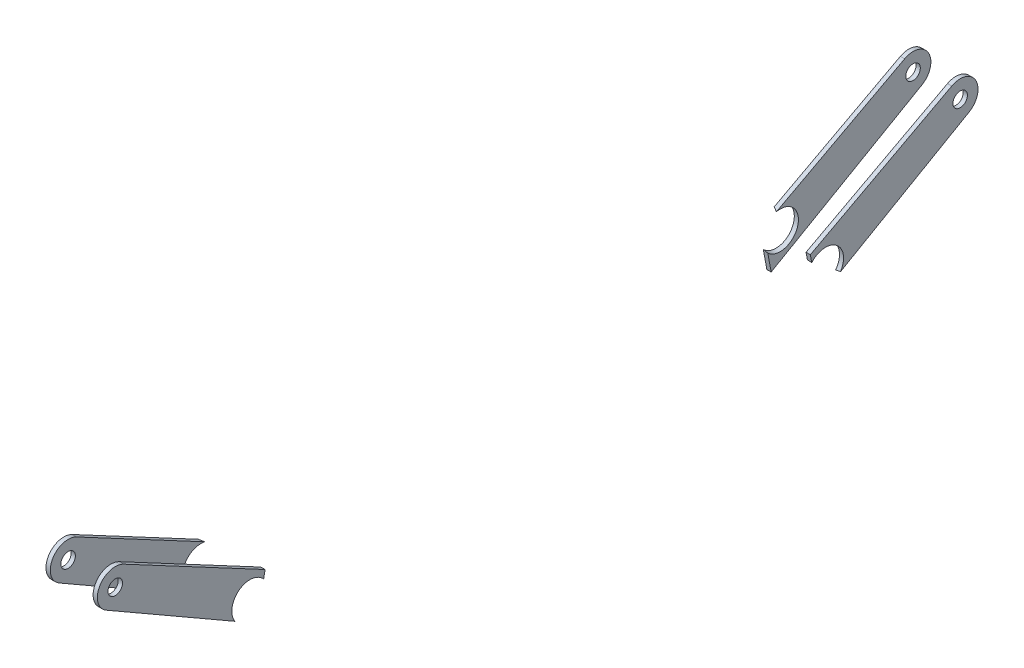
ISO-10303-21;
HEADER;
FILE_DESCRIPTION(('STEP AP214'),'2;1');
FILE_NAME('part.step','',(''),(''),'','','');
FILE_SCHEMA(('AUTOMOTIVE_DESIGN { 1 0 10303 214 1 1 1 1 }'));
ENDSEC;
DATA;
#1=APPLICATION_CONTEXT('core data for automotive mechanical design processes');
#2=APPLICATION_PROTOCOL_DEFINITION('international standard','automotive_design',2000,#1);
#3=PRODUCT_CONTEXT('',#1,'mechanical');
#4=PRODUCT('Part','Part','',(#3));
#5=PRODUCT_RELATED_PRODUCT_CATEGORY('part','',(#4));
#6=PRODUCT_DEFINITION_FORMATION('','',#4);
#7=PRODUCT_DEFINITION_CONTEXT('part definition',#1,'design');
#8=PRODUCT_DEFINITION('design','',#6,#7);
#9=PRODUCT_DEFINITION_SHAPE('','',#8);
#10=(LENGTH_UNIT() NAMED_UNIT(*) SI_UNIT(.MILLI.,.METRE.));
#11=(NAMED_UNIT(*) PLANE_ANGLE_UNIT() SI_UNIT($,.RADIAN.));
#12=(NAMED_UNIT(*) SI_UNIT($,.STERADIAN.) SOLID_ANGLE_UNIT());
#13=UNCERTAINTY_MEASURE_WITH_UNIT(LENGTH_MEASURE(1.E-05),#10,'distance_accuracy_value','');
#14=(GEOMETRIC_REPRESENTATION_CONTEXT(3) GLOBAL_UNCERTAINTY_ASSIGNED_CONTEXT((#13)) GLOBAL_UNIT_ASSIGNED_CONTEXT((#10,
#11,#12)) REPRESENTATION_CONTEXT('',''));
#15=CARTESIAN_POINT('',(0.,0.,0.));
#16=DIRECTION('',(0.,0.,1.));
#17=DIRECTION('',(1.,0.,0.));
#18=AXIS2_PLACEMENT_3D('',#15,#16,#17);
#19=CARTESIAN_POINT('',(942.,45.5636748828678,243.393475636366));
#20=DIRECTION('',(0.,-0.184005288410075,-0.982925253433406));
#21=DIRECTION('',(0.,-0.982925253433406,0.184005288410075));
#22=AXIS2_PLACEMENT_3D('',#19,#20,#21);
#23=PLANE('',#22);
#24=DIRECTION('',(0.,-0.982925253433406,0.184005288410075));
#25=VECTOR('',#24,1.);
#26=CARTESIAN_POINT('',(945.,45.5636748828678,243.393475636366));
#27=LINE('',#26,#25);
#28=CARTESIAN_POINT('',(945.,308.994873823411,194.078704683083));
#29=VERTEX_POINT('',#28);
#30=CARTESIAN_POINT('',(945.,296.336042583873,196.448459539853));
#31=VERTEX_POINT('',#30);
#32=EDGE_CURVE('E103',#29,#31,#27,.T.);
#33=ORIENTED_EDGE('',*,*,#32,.T.);
#34=DIRECTION('',(1.,0.,0.));
#35=VECTOR('',#34,1.);
#36=CARTESIAN_POINT('',(942.,296.336042583873,196.448459539853));
#37=LINE('',#36,#35);
#38=CARTESIAN_POINT('',(942.,296.336042583873,196.448459539853));
#39=VERTEX_POINT('',#38);
#40=EDGE_CURVE('E124',#39,#31,#37,.T.);
#41=ORIENTED_EDGE('',*,*,#40,.F.);
#42=DIRECTION('',(0.,-0.982925253433406,0.184005288410075));
#43=VECTOR('',#42,1.);
#44=CARTESIAN_POINT('',(942.,45.5636748828678,243.393475636366));
#45=LINE('',#44,#43);
#46=CARTESIAN_POINT('',(942.,309.822620696571,193.923749052841));
#47=VERTEX_POINT('',#46);
#48=EDGE_CURVE('E122',#47,#39,#45,.T.);
#49=ORIENTED_EDGE('',*,*,#48,.F.);
#50=CARTESIAN_POINT('',(1082.48907602166,293.161292829988,197.042778123135));
#51=DIRECTION('',(0.,0.184005288410075,0.982925253433406));
#52=DIRECTION('',(0.985358258221693,-0.167585449342957,0.0313722827162788));
#53=AXIS2_PLACEMENT_3D('',#50,#51,#52);
#54=ELLIPSE('',#53,172.129049879404,12.7);
#55=EDGE_CURVE('E125',#29,#47,#54,.F.);
#56=ORIENTED_EDGE('',*,*,#55,.F.);
#57=EDGE_LOOP('',(#33,#41,#49,#56));
#58=FACE_BOUND('',#57,.T.);
#59=ADVANCED_FACE('F50',(#58),#23,.T.);
#60=CARTESIAN_POINT('',(942.,367.858419329999,295.772586620002));
#61=DIRECTION('',(1.,0.,0.));
#62=DIRECTION('',(0.,0.,1.));
#63=AXIS2_PLACEMENT_3D('',#60,#61,#62);
#64=CYLINDRICAL_SURFACE('',#63,12.5);
#65=CARTESIAN_POINT('',(945.,367.858419329999,295.772586620002));
#66=DIRECTION('',(1.,0.,0.));
#67=DIRECTION('',(0.,0.,-1.));
#68=AXIS2_PLACEMENT_3D('',#65,#66,#67);
#69=CIRCLE('',#68,12.5);
#70=CARTESIAN_POINT('',(945.,378.890499641518,289.895239939721));
#71=VERTEX_POINT('',#70);
#72=CARTESIAN_POINT('',(945.,357.021731817941,302.00285176412));
#73=VERTEX_POINT('',#72);
#74=EDGE_CURVE('E134',#71,#73,#69,.T.);
#75=ORIENTED_EDGE('',*,*,#74,.F.);
#76=DIRECTION('',(1.,0.,0.));
#77=VECTOR('',#76,1.);
#78=CARTESIAN_POINT('',(942.,378.890499641518,289.895239939721));
#79=LINE('',#78,#77);
#80=CARTESIAN_POINT('',(942.,378.890499641518,289.895239939721));
#81=VERTEX_POINT('',#80);
#82=EDGE_CURVE('E111',#81,#71,#79,.T.);
#83=ORIENTED_EDGE('',*,*,#82,.F.);
#84=CARTESIAN_POINT('',(942.,367.858419329999,295.772586620002));
#85=DIRECTION('',(1.,0.,0.));
#86=DIRECTION('',(0.,0.,-1.));
#87=AXIS2_PLACEMENT_3D('',#84,#85,#86);
#88=CIRCLE('',#87,12.5);
#89=CARTESIAN_POINT('',(942.,357.021731817941,302.00285176412));
#90=VERTEX_POINT('',#89);
#91=EDGE_CURVE('E118',#81,#90,#88,.T.);
#92=ORIENTED_EDGE('',*,*,#91,.T.);
#93=DIRECTION('',(1.,0.,0.));
#94=VECTOR('',#93,1.);
#95=CARTESIAN_POINT('',(942.,357.021731817941,302.00285176412));
#96=LINE('',#95,#94);
#97=EDGE_CURVE('E129',#90,#73,#96,.T.);
#98=ORIENTED_EDGE('',*,*,#97,.T.);
#99=EDGE_LOOP('',(#75,#83,#92,#98));
#100=FACE_BOUND('',#99,.T.);
#101=ADVANCED_FACE('F142',(#100),#64,.T.);
#102=CARTESIAN_POINT('',(942.,137.834002874389,-79.2439924863662));
#103=DIRECTION('',(0.,-0.86693500096461,0.498421211529456));
#104=DIRECTION('',(0.,0.498421211529456,0.86693500096461));
#105=AXIS2_PLACEMENT_3D('',#102,#103,#104);
#106=PLANE('',#105);
#107=DIRECTION('',(0.,0.498421211529456,0.86693500096461));
#108=VECTOR('',#107,1.);
#109=CARTESIAN_POINT('',(945.,137.834002874389,-79.2439924863662));
#110=LINE('',#109,#108);
#111=EDGE_CURVE('E113',#31,#73,#110,.T.);
#112=ORIENTED_EDGE('',*,*,#111,.T.);
#113=ORIENTED_EDGE('',*,*,#97,.F.);
#114=DIRECTION('',(0.,0.498421211529456,0.86693500096461));
#115=VECTOR('',#114,1.);
#116=CARTESIAN_POINT('',(942.,137.834002874389,-79.2439924863662));
#117=LINE('',#116,#115);
#118=EDGE_CURVE('E132',#39,#90,#117,.T.);
#119=ORIENTED_EDGE('',*,*,#118,.F.);
#120=ORIENTED_EDGE('',*,*,#40,.T.);
#121=EDGE_LOOP('',(#112,#113,#119,#120));
#122=FACE_BOUND('',#121,.T.);
#123=ADVANCED_FACE('F146',(#122),#106,.T.);
#124=CARTESIAN_POINT('',(942.,367.858419329999,295.772586620002));
#125=DIRECTION('',(1.,0.,0.));
#126=DIRECTION('',(0.,0.,1.));
#127=AXIS2_PLACEMENT_3D('',#124,#125,#126);
#128=CYLINDRICAL_SURFACE('',#127,5.09999999999999);
#129=CARTESIAN_POINT('',(942.,367.858419329999,295.772586620002));
#130=DIRECTION('',(1.,0.,0.));
#131=DIRECTION('',(0.,0.,-1.));
#132=AXIS2_PLACEMENT_3D('',#129,#130,#131);
#133=CIRCLE('',#132,5.09999999999999);
#134=CARTESIAN_POINT('',(942.,367.858419329999,290.672586620002));
#135=VERTEX_POINT('',#134);
#136=EDGE_CURVE('E121',#135,#135,#133,.T.);
#137=ORIENTED_EDGE('',*,*,#136,.F.);
#138=EDGE_LOOP('',(#137));
#139=FACE_BOUND('',#138,.T.);
#140=CARTESIAN_POINT('',(945.,367.858419329999,295.772586620002));
#141=DIRECTION('',(1.,0.,0.));
#142=DIRECTION('',(0.,0.,-1.));
#143=AXIS2_PLACEMENT_3D('',#140,#141,#142);
#144=CIRCLE('',#143,5.09999999999999);
#145=CARTESIAN_POINT('',(945.,367.858419329999,290.672586620002));
#146=VERTEX_POINT('',#145);
#147=EDGE_CURVE('E60',#146,#146,#144,.T.);
#148=ORIENTED_EDGE('',*,*,#147,.T.);
#149=EDGE_LOOP('',(#148));
#150=FACE_BOUND('',#149,.T.);
#151=ADVANCED_FACE('F158',(#139,#150),#128,.F.);
#152=CARTESIAN_POINT('',(942.,174.828331192109,-93.1398868514354));
#153=DIRECTION('',(0.,0.882566424921512,-0.470187734422392));
#154=DIRECTION('',(0.,-0.470187734422392,-0.882566424921512));
#155=AXIS2_PLACEMENT_3D('',#152,#153,#154);
#156=PLANE('',#155);
#157=DIRECTION('',(0.,-0.470187734422392,-0.882566424921512));
#158=VECTOR('',#157,1.);
#159=CARTESIAN_POINT('',(942.,174.828331192109,-93.1398868514354));
#160=LINE('',#159,#158);
#161=CARTESIAN_POINT('',(942.,331.81956219008,201.540682934411));
#162=VERTEX_POINT('',#161);
#163=EDGE_CURVE('E107',#81,#162,#160,.T.);
#164=ORIENTED_EDGE('',*,*,#163,.F.);
#165=ORIENTED_EDGE('',*,*,#82,.T.);
#166=DIRECTION('',(0.,-0.470187734422392,-0.882566424921512));
#167=VECTOR('',#166,1.);
#168=CARTESIAN_POINT('',(945.,174.828331192109,-93.1398868514354));
#169=LINE('',#168,#167);
#170=CARTESIAN_POINT('',(945.,331.028402659965,200.055636033103));
#171=VERTEX_POINT('',#170);
#172=EDGE_CURVE('E100',#71,#171,#169,.T.);
#173=ORIENTED_EDGE('',*,*,#172,.T.);
#174=CARTESIAN_POINT('',(858.006304522725,334.441720058987,206.462607362711));
#175=DIRECTION('',(0.,-0.882566424921512,0.470187734422392));
#176=DIRECTION('',(0.992460257714831,-0.0576294374532364,-0.108173401515509));
#177=AXIS2_PLACEMENT_3D('',#174,#175,#176);
#178=ELLIPSE('',#177,90.6522629238937,12.7);
#179=EDGE_CURVE('E105',#162,#171,#178,.F.);
#180=ORIENTED_EDGE('',*,*,#179,.F.);
#181=EDGE_LOOP('',(#164,#165,#173,#180));
#182=FACE_BOUND('',#181,.T.);
#183=ADVANCED_FACE('F109',(#182),#156,.T.);
#184=CARTESIAN_POINT('',(942.,0.,0.));
#185=DIRECTION('',(-1.,0.,0.));
#186=DIRECTION('',(0.,0.,-1.));
#187=AXIS2_PLACEMENT_3D('',#184,#185,#186);
#188=PLANE('',#187);
#189=ORIENTED_EDGE('',*,*,#136,.T.);
#190=EDGE_LOOP('',(#189));
#191=FACE_BOUND('',#190,.T.);
#192=ORIENTED_EDGE('',*,*,#48,.T.);
#193=ORIENTED_EDGE('',*,*,#118,.T.);
#194=ORIENTED_EDGE('',*,*,#91,.F.);
#195=ORIENTED_EDGE('',*,*,#163,.T.);
#196=CARTESIAN_POINT('',(942.,318.996010748236,202.938032789287));
#197=DIRECTION('',(1.,0.,0.));
#198=DIRECTION('',(0.,-0.974938972330076,-0.222472470728346));
#199=AXIS2_PLACEMENT_3D('',#196,#197,#198);
#200=ELLIPSE('',#199,12.9239386363324,12.7);
#201=EDGE_CURVE('E54',#47,#162,#200,.F.);
#202=ORIENTED_EDGE('',*,*,#201,.F.);
#203=EDGE_LOOP('',(#192,#193,#194,#195,#202));
#204=FACE_BOUND('',#203,.T.);
#205=ADVANCED_FACE('F149',(#191,#204),#188,.T.);
#206=CARTESIAN_POINT('',(945.,0.,0.));
#207=DIRECTION('',(-1.,0.,0.));
#208=DIRECTION('',(0.,0.,-1.));
#209=AXIS2_PLACEMENT_3D('',#206,#207,#208);
#210=PLANE('',#209);
#211=CARTESIAN_POINT('',(945.,318.444336867608,202.812145677639));
#212=DIRECTION('',(1.,0.,0.));
#213=DIRECTION('',(0.,-0.974938972330076,-0.222472470728346));
#214=AXIS2_PLACEMENT_3D('',#211,#212,#213);
#215=ELLIPSE('',#214,12.9239386363324,12.7);
#216=EDGE_CURVE('E12',#29,#171,#215,.F.);
#217=ORIENTED_EDGE('',*,*,#216,.T.);
#218=ORIENTED_EDGE('',*,*,#172,.F.);
#219=ORIENTED_EDGE('',*,*,#74,.T.);
#220=ORIENTED_EDGE('',*,*,#111,.F.);
#221=ORIENTED_EDGE('',*,*,#32,.F.);
#222=EDGE_LOOP('',(#217,#218,#219,#220,#221));
#223=FACE_BOUND('',#222,.T.);
#224=ORIENTED_EDGE('',*,*,#147,.F.);
#225=EDGE_LOOP('',(#224));
#226=FACE_BOUND('',#225,.T.);
#227=ADVANCED_FACE('F96',(#223,#226),#210,.F.);
#228=CARTESIAN_POINT('',(773.70714337,349.94360184793,209.999999999999));
#229=DIRECTION('',(0.982672570442046,-0.180704930107559,-0.0412352705295394));
#230=DIRECTION('',(0.180858756895923,0.983509079802552,0.));
#231=AXIS2_PLACEMENT_3D('',#228,#229,#230);
#232=CYLINDRICAL_SURFACE('',#231,12.7);
#233=ORIENTED_EDGE('',*,*,#55,.T.);
#234=ORIENTED_EDGE('',*,*,#201,.T.);
#235=ORIENTED_EDGE('',*,*,#179,.T.);
#236=ORIENTED_EDGE('',*,*,#216,.F.);
#237=EDGE_LOOP('',(#233,#234,#235,#236));
#238=FACE_BOUND('',#237,.T.);
#239=ADVANCED_FACE('F52',(#238),#232,.F.);
#240=CLOSED_SHELL('',(#59,#101,#123,#151,#183,#205,#227,#239));
#241=MANIFOLD_SOLID_BREP('B2',#240);
#242=CARTESIAN_POINT('',(978.000000000001,137.834002874389,-79.2439924863662));
#243=DIRECTION('',(0.,-0.86693500096461,0.498421211529456));
#244=DIRECTION('',(0.,0.498421211529456,0.86693500096461));
#245=AXIS2_PLACEMENT_3D('',#242,#243,#244);
#246=PLANE('',#245);
#247=DIRECTION('',(0.,0.498421211529456,0.86693500096461));
#248=VECTOR('',#247,1.);
#249=CARTESIAN_POINT('',(978.000000000001,137.834002874389,-79.2439924863662));
#250=LINE('',#249,#248);
#251=CARTESIAN_POINT('',(978.000000000001,305.269680891473,211.987292068771));
#252=VERTEX_POINT('',#251);
#253=CARTESIAN_POINT('',(978.000000000001,357.021731817941,302.00285176412));
#254=VERTEX_POINT('',#253);
#255=EDGE_CURVE('E243',#252,#254,#250,.T.);
#256=ORIENTED_EDGE('',*,*,#255,.T.);
#257=DIRECTION('',(-1.,0.,0.));
#258=VECTOR('',#257,1.);
#259=CARTESIAN_POINT('',(978.000000000001,357.021731817941,302.00285176412));
#260=LINE('',#259,#258);
#261=CARTESIAN_POINT('',(975.000000000001,357.021731817941,302.00285176412));
#262=VERTEX_POINT('',#261);
#263=EDGE_CURVE('E303',#254,#262,#260,.T.);
#264=ORIENTED_EDGE('',*,*,#263,.T.);
#265=DIRECTION('',(0.,0.498421211529456,0.86693500096461));
#266=VECTOR('',#265,1.);
#267=CARTESIAN_POINT('',(975.000000000001,137.834002874389,-79.2439924863662));
#268=LINE('',#267,#266);
#269=CARTESIAN_POINT('',(975.000000000001,305.009648322802,211.535001255383));
#270=VERTEX_POINT('',#269);
#271=EDGE_CURVE('E291',#270,#262,#268,.T.);
#272=ORIENTED_EDGE('',*,*,#271,.F.);
#273=CARTESIAN_POINT('',(1060.47917269027,297.208722424349,197.966365842482));
#274=DIRECTION('',(0.,0.86693500096461,-0.498421211529456));
#275=DIRECTION('',(0.991903064456792,-0.0632981412861595,-0.110098392499356));
#276=AXIS2_PLACEMENT_3D('',#273,#274,#275);
#277=ELLIPSE('',#276,93.3090125636205,12.7);
#278=EDGE_CURVE('E296',#252,#270,#277,.F.);
#279=ORIENTED_EDGE('',*,*,#278,.F.);
#280=EDGE_LOOP('',(#256,#264,#272,#279));
#281=FACE_BOUND('',#280,.T.);
#282=ADVANCED_FACE('F239',(#281),#246,.T.);
#283=CARTESIAN_POINT('',(978.000000000001,0.,0.));
#284=DIRECTION('',(1.,0.,0.));
#285=DIRECTION('',(0.,0.,-1.));
#286=AXIS2_PLACEMENT_3D('',#283,#284,#285);
#287=PLANE('',#286);
#288=CARTESIAN_POINT('',(978.000000000001,367.858419329999,295.772586620002));
#289=DIRECTION('',(1.,0.,0.));
#290=DIRECTION('',(0.,0.,-1.));
#291=AXIS2_PLACEMENT_3D('',#288,#289,#290);
#292=CIRCLE('',#291,5.09999999999999);
#293=CARTESIAN_POINT('',(978.000000000001,367.858419329999,290.672586620002));
#294=VERTEX_POINT('',#293);
#295=EDGE_CURVE('E304',#294,#294,#292,.T.);
#296=ORIENTED_EDGE('',*,*,#295,.F.);
#297=EDGE_LOOP('',(#296));
#298=FACE_BOUND('',#297,.T.);
#299=DIRECTION('',(0.,-0.982925253433406,0.184005288410075));
#300=VECTOR('',#299,1.);
#301=CARTESIAN_POINT('',(978.000000000001,45.5636748828678,243.393475636366));
#302=LINE('',#301,#300);
#303=CARTESIAN_POINT('',(978.000000000001,326.134794007556,190.870082312467));
#304=VERTEX_POINT('',#303);
#305=CARTESIAN_POINT('',(978.000000000001,320.811489069924,191.866614100538));
#306=VERTEX_POINT('',#305);
#307=EDGE_CURVE('E307',#304,#306,#302,.T.);
#308=ORIENTED_EDGE('',*,*,#307,.F.);
#309=DIRECTION('',(0.,-0.470187734422392,-0.882566424921512));
#310=VECTOR('',#309,1.);
#311=CARTESIAN_POINT('',(978.000000000001,174.828331192109,-93.1398868514354));
#312=LINE('',#311,#310);
#313=CARTESIAN_POINT('',(978.000000000001,378.890499641518,289.895239939721));
#314=VERTEX_POINT('',#313);
#315=EDGE_CURVE('E313',#314,#304,#312,.T.);
#316=ORIENTED_EDGE('',*,*,#315,.F.);
#317=CARTESIAN_POINT('',(978.000000000001,367.858419329999,295.772586620002));
#318=DIRECTION('',(1.,0.,0.));
#319=DIRECTION('',(0.,0.,-1.));
#320=AXIS2_PLACEMENT_3D('',#317,#318,#319);
#321=CIRCLE('',#320,12.5);
#322=EDGE_CURVE('E320',#314,#254,#321,.T.);
#323=ORIENTED_EDGE('',*,*,#322,.T.);
#324=ORIENTED_EDGE('',*,*,#255,.F.);
#325=CARTESIAN_POINT('',(978.000000000001,312.375924180697,201.427387449512));
#326=DIRECTION('',(-1.,0.,0.));
#327=DIRECTION('',(0.,-0.974938972330076,-0.222472470728346));
#328=AXIS2_PLACEMENT_3D('',#325,#326,#327);
#329=ELLIPSE('',#328,12.9239386363324,12.7);
#330=EDGE_CURVE('E297',#306,#252,#329,.F.);
#331=ORIENTED_EDGE('',*,*,#330,.F.);
#332=EDGE_LOOP('',(#308,#316,#323,#324,#331));
#333=FACE_BOUND('',#332,.T.);
#334=ADVANCED_FACE('F351',(#298,#333),#287,.T.);
#335=CARTESIAN_POINT('',(975.000000000001,0.,0.));
#336=DIRECTION('',(1.,0.,0.));
#337=DIRECTION('',(0.,0.,-1.));
#338=AXIS2_PLACEMENT_3D('',#335,#336,#337);
#339=PLANE('',#338);
#340=CARTESIAN_POINT('',(975.000000000001,312.927598061326,201.55327456116));
#341=DIRECTION('',(-1.,0.,0.));
#342=DIRECTION('',(0.,-0.974938972330076,-0.222472470728346));
#343=AXIS2_PLACEMENT_3D('',#340,#341,#342);
#344=ELLIPSE('',#343,12.9239386363324,12.7);
#345=CARTESIAN_POINT('',(975.000000000001,321.139528150929,191.805204623572));
#346=VERTEX_POINT('',#345);
#347=EDGE_CURVE('E48',#346,#270,#344,.F.);
#348=ORIENTED_EDGE('',*,*,#347,.T.);
#349=ORIENTED_EDGE('',*,*,#271,.T.);
#350=CARTESIAN_POINT('',(975.000000000001,367.858419329999,295.772586620002));
#351=DIRECTION('',(1.,0.,0.));
#352=DIRECTION('',(0.,0.,-1.));
#353=AXIS2_PLACEMENT_3D('',#350,#351,#352);
#354=CIRCLE('',#353,12.5);
#355=CARTESIAN_POINT('',(975.000000000001,378.890499641518,289.895239939721));
#356=VERTEX_POINT('',#355);
#357=EDGE_CURVE('E315',#356,#262,#354,.T.);
#358=ORIENTED_EDGE('',*,*,#357,.F.);
#359=DIRECTION('',(0.,-0.470187734422392,-0.882566424921512));
#360=VECTOR('',#359,1.);
#361=CARTESIAN_POINT('',(975.000000000001,174.828331192109,-93.1398868514354));
#362=LINE('',#361,#360);
#363=CARTESIAN_POINT('',(975.000000000001,326.134794007556,190.870082312467));
#364=VERTEX_POINT('',#363);
#365=EDGE_CURVE('E331',#356,#364,#362,.T.);
#366=ORIENTED_EDGE('',*,*,#365,.T.);
#367=DIRECTION('',(0.,-0.982925253433406,0.184005288410075));
#368=VECTOR('',#367,1.);
#369=CARTESIAN_POINT('',(975.000000000001,45.5636748828678,243.393475636366));
#370=LINE('',#369,#368);
#371=EDGE_CURVE('E294',#364,#346,#370,.T.);
#372=ORIENTED_EDGE('',*,*,#371,.T.);
#373=EDGE_LOOP('',(#348,#349,#358,#366,#372));
#374=FACE_BOUND('',#373,.T.);
#375=CARTESIAN_POINT('',(975.000000000001,367.858419329999,295.772586620002));
#376=DIRECTION('',(1.,0.,0.));
#377=DIRECTION('',(0.,0.,-1.));
#378=AXIS2_PLACEMENT_3D('',#375,#376,#377);
#379=CIRCLE('',#378,5.09999999999999);
#380=CARTESIAN_POINT('',(975.000000000001,367.858419329999,290.672586620002));
#381=VERTEX_POINT('',#380);
#382=EDGE_CURVE('E324',#381,#381,#379,.T.);
#383=ORIENTED_EDGE('',*,*,#382,.T.);
#384=EDGE_LOOP('',(#383));
#385=FACE_BOUND('',#384,.T.);
#386=ADVANCED_FACE('F287',(#374,#385),#339,.F.);
#387=CARTESIAN_POINT('',(978.000000000001,367.858419329999,295.772586620002));
#388=DIRECTION('',(-1.,0.,0.));
#389=DIRECTION('',(0.,0.,1.));
#390=AXIS2_PLACEMENT_3D('',#387,#388,#389);
#391=CYLINDRICAL_SURFACE('',#390,12.5);
#392=ORIENTED_EDGE('',*,*,#357,.T.);
#393=ORIENTED_EDGE('',*,*,#263,.F.);
#394=ORIENTED_EDGE('',*,*,#322,.F.);
#395=DIRECTION('',(-1.,0.,0.));
#396=VECTOR('',#395,1.);
#397=CARTESIAN_POINT('',(978.000000000001,378.890499641518,289.895239939721));
#398=LINE('',#397,#396);
#399=EDGE_CURVE('E249',#314,#356,#398,.T.);
#400=ORIENTED_EDGE('',*,*,#399,.T.);
#401=EDGE_LOOP('',(#392,#393,#394,#400));
#402=FACE_BOUND('',#401,.T.);
#403=ADVANCED_FACE('F347',(#402),#391,.T.);
#404=CARTESIAN_POINT('',(978.000000000001,45.5636748828678,243.393475636366));
#405=DIRECTION('',(0.,-0.184005288410075,-0.982925253433406));
#406=DIRECTION('',(0.,-0.982925253433406,0.184005288410075));
#407=AXIS2_PLACEMENT_3D('',#404,#405,#406);
#408=PLANE('',#407);
#409=ORIENTED_EDGE('',*,*,#371,.F.);
#410=DIRECTION('',(-1.,0.,0.));
#411=VECTOR('',#410,1.);
#412=CARTESIAN_POINT('',(978.000000000001,326.134794007556,190.870082312467));
#413=LINE('',#412,#411);
#414=EDGE_CURVE('E312',#304,#364,#413,.T.);
#415=ORIENTED_EDGE('',*,*,#414,.F.);
#416=ORIENTED_EDGE('',*,*,#307,.T.);
#417=CARTESIAN_POINT('',(1082.48907602166,293.161292829988,197.042778123135));
#418=DIRECTION('',(0.,0.184005288410075,0.982925253433406));
#419=DIRECTION('',(0.985358258221693,-0.167585449342957,0.0313722827162788));
#420=AXIS2_PLACEMENT_3D('',#417,#418,#419);
#421=ELLIPSE('',#420,172.129049879404,12.7);
#422=EDGE_CURVE('E257',#346,#306,#421,.F.);
#423=ORIENTED_EDGE('',*,*,#422,.F.);
#424=EDGE_LOOP('',(#409,#415,#416,#423));
#425=FACE_BOUND('',#424,.T.);
#426=ADVANCED_FACE('F339',(#425),#408,.T.);
#427=CARTESIAN_POINT('',(978.000000000001,367.858419329999,295.772586620002));
#428=DIRECTION('',(-1.,0.,0.));
#429=DIRECTION('',(0.,0.,1.));
#430=AXIS2_PLACEMENT_3D('',#427,#428,#429);
#431=CYLINDRICAL_SURFACE('',#430,5.09999999999999);
#432=ORIENTED_EDGE('',*,*,#295,.T.);
#433=EDGE_LOOP('',(#432));
#434=FACE_BOUND('',#433,.T.);
#435=ORIENTED_EDGE('',*,*,#382,.F.);
#436=EDGE_LOOP('',(#435));
#437=FACE_BOUND('',#436,.T.);
#438=ADVANCED_FACE('F336',(#434,#437),#431,.F.);
#439=CARTESIAN_POINT('',(978.000000000001,174.828331192109,-93.1398868514354));
#440=DIRECTION('',(0.,0.882566424921512,-0.470187734422392));
#441=DIRECTION('',(0.,-0.470187734422392,-0.882566424921512));
#442=AXIS2_PLACEMENT_3D('',#439,#440,#441);
#443=PLANE('',#442);
#444=ORIENTED_EDGE('',*,*,#365,.F.);
#445=ORIENTED_EDGE('',*,*,#399,.F.);
#446=ORIENTED_EDGE('',*,*,#315,.T.);
#447=ORIENTED_EDGE('',*,*,#414,.T.);
#448=EDGE_LOOP('',(#444,#445,#446,#447));
#449=FACE_BOUND('',#448,.T.);
#450=ADVANCED_FACE('F338',(#449),#443,.T.);
#451=CARTESIAN_POINT('',(773.70714337,349.94360184793,209.999999999999));
#452=DIRECTION('',(0.982672570442046,-0.180704930107559,-0.0412352705295394));
#453=DIRECTION('',(0.180858756895923,0.983509079802552,0.));
#454=AXIS2_PLACEMENT_3D('',#451,#452,#453);
#455=CYLINDRICAL_SURFACE('',#454,12.7);
#456=ORIENTED_EDGE('',*,*,#422,.T.);
#457=ORIENTED_EDGE('',*,*,#330,.T.);
#458=ORIENTED_EDGE('',*,*,#278,.T.);
#459=ORIENTED_EDGE('',*,*,#347,.F.);
#460=EDGE_LOOP('',(#456,#457,#458,#459));
#461=FACE_BOUND('',#460,.T.);
#462=ADVANCED_FACE('F241',(#461),#455,.F.);
#463=CLOSED_SHELL('',(#282,#334,#386,#403,#426,#438,#450,#462));
#464=MANIFOLD_SOLID_BREP('B6',#463);
#465=CARTESIAN_POINT('',(942.,45.5636748828678,-243.393475636366));
#466=DIRECTION('',(0.,-0.184005288410075,0.982925253433406));
#467=DIRECTION('',(0.,-0.982925253433406,-0.184005288410075));
#468=AXIS2_PLACEMENT_3D('',#465,#466,#467);
#469=PLANE('',#468);
#470=DIRECTION('',(0.,-0.982925253433406,-0.184005288410075));
#471=VECTOR('',#470,1.);
#472=CARTESIAN_POINT('',(945.,45.5636748828678,-243.393475636366));
#473=LINE('',#472,#471);
#474=CARTESIAN_POINT('',(945.,308.994873823411,-194.078704683083));
#475=VERTEX_POINT('',#474);
#476=CARTESIAN_POINT('',(945.,296.336042583873,-196.448459539853));
#477=VERTEX_POINT('',#476);
#478=EDGE_CURVE('E491',#475,#477,#473,.T.);
#479=ORIENTED_EDGE('',*,*,#478,.F.);
#480=CARTESIAN_POINT('',(1082.48907602166,293.161292829988,-197.042778123135));
#481=DIRECTION('',(0.,-0.184005288410075,0.982925253433406));
#482=DIRECTION('',(0.985358258221693,-0.167585449342957,-0.0313722827162788));
#483=AXIS2_PLACEMENT_3D('',#480,#481,#482);
#484=ELLIPSE('',#483,172.129049879404,12.7);
#485=CARTESIAN_POINT('',(942.,309.822620696571,-193.923749052841));
#486=VERTEX_POINT('',#485);
#487=EDGE_CURVE('E467',#475,#486,#484,.F.);
#488=ORIENTED_EDGE('',*,*,#487,.T.);
#489=DIRECTION('',(0.,-0.982925253433406,-0.184005288410075));
#490=VECTOR('',#489,1.);
#491=CARTESIAN_POINT('',(942.,45.5636748828678,-243.393475636366));
#492=LINE('',#491,#490);
#493=CARTESIAN_POINT('',(942.,296.336042583873,-196.448459539853));
#494=VERTEX_POINT('',#493);
#495=EDGE_CURVE('E498',#486,#494,#492,.T.);
#496=ORIENTED_EDGE('',*,*,#495,.T.);
#497=DIRECTION('',(1.,0.,0.));
#498=VECTOR('',#497,1.);
#499=CARTESIAN_POINT('',(942.,296.336042583873,-196.448459539853));
#500=LINE('',#499,#498);
#501=EDGE_CURVE('E500',#494,#477,#500,.T.);
#502=ORIENTED_EDGE('',*,*,#501,.T.);
#503=EDGE_LOOP('',(#479,#488,#496,#502));
#504=FACE_BOUND('',#503,.T.);
#505=ADVANCED_FACE('F427',(#504),#469,.T.);
#506=CARTESIAN_POINT('',(942.,367.858419329999,-295.772586620002));
#507=DIRECTION('',(1.,0.,0.));
#508=DIRECTION('',(0.,0.,-1.));
#509=AXIS2_PLACEMENT_3D('',#506,#507,#508);
#510=CYLINDRICAL_SURFACE('',#509,12.5);
#511=CARTESIAN_POINT('',(945.,367.858419329999,-295.772586620002));
#512=DIRECTION('',(-1.,0.,0.));
#513=DIRECTION('',(0.,0.,1.));
#514=AXIS2_PLACEMENT_3D('',#511,#512,#513);
#515=CIRCLE('',#514,12.5);
#516=CARTESIAN_POINT('',(945.,378.890499641518,-289.895239939721));
#517=VERTEX_POINT('',#516);
#518=CARTESIAN_POINT('',(945.,357.021731817941,-302.00285176412));
#519=VERTEX_POINT('',#518);
#520=EDGE_CURVE('E487',#517,#519,#515,.T.);
#521=ORIENTED_EDGE('',*,*,#520,.T.);
#522=DIRECTION('',(1.,0.,0.));
#523=VECTOR('',#522,1.);
#524=CARTESIAN_POINT('',(942.,357.021731817941,-302.00285176412));
#525=LINE('',#524,#523);
#526=CARTESIAN_POINT('',(942.,357.021731817941,-302.00285176412));
#527=VERTEX_POINT('',#526);
#528=EDGE_CURVE('E504',#527,#519,#525,.T.);
#529=ORIENTED_EDGE('',*,*,#528,.F.);
#530=CARTESIAN_POINT('',(942.,367.858419329999,-295.772586620002));
#531=DIRECTION('',(-1.,0.,0.));
#532=DIRECTION('',(0.,0.,1.));
#533=AXIS2_PLACEMENT_3D('',#530,#531,#532);
#534=CIRCLE('',#533,12.5);
#535=CARTESIAN_POINT('',(942.,378.890499641518,-289.895239939721));
#536=VERTEX_POINT('',#535);
#537=EDGE_CURVE('E494',#536,#527,#534,.T.);
#538=ORIENTED_EDGE('',*,*,#537,.F.);
#539=DIRECTION('',(1.,0.,0.));
#540=VECTOR('',#539,1.);
#541=CARTESIAN_POINT('',(942.,378.890499641518,-289.895239939721));
#542=LINE('',#541,#540);
#543=EDGE_CURVE('E508',#536,#517,#542,.T.);
#544=ORIENTED_EDGE('',*,*,#543,.T.);
#545=EDGE_LOOP('',(#521,#529,#538,#544));
#546=FACE_BOUND('',#545,.T.);
#547=ADVANCED_FACE('F522',(#546),#510,.T.);
#548=CARTESIAN_POINT('',(942.,137.834002874389,79.2439924863662));
#549=DIRECTION('',(0.,-0.86693500096461,-0.498421211529456));
#550=DIRECTION('',(0.,0.498421211529456,-0.86693500096461));
#551=AXIS2_PLACEMENT_3D('',#548,#549,#550);
#552=PLANE('',#551);
#553=DIRECTION('',(0.,0.498421211529456,-0.86693500096461));
#554=VECTOR('',#553,1.);
#555=CARTESIAN_POINT('',(945.,137.834002874389,79.2439924863662));
#556=LINE('',#555,#554);
#557=EDGE_CURVE('E488',#477,#519,#556,.T.);
#558=ORIENTED_EDGE('',*,*,#557,.F.);
#559=ORIENTED_EDGE('',*,*,#501,.F.);
#560=DIRECTION('',(0.,0.498421211529456,-0.86693500096461));
#561=VECTOR('',#560,1.);
#562=CARTESIAN_POINT('',(942.,137.834002874389,79.2439924863662));
#563=LINE('',#562,#561);
#564=EDGE_CURVE('E506',#494,#527,#563,.T.);
#565=ORIENTED_EDGE('',*,*,#564,.T.);
#566=ORIENTED_EDGE('',*,*,#528,.T.);
#567=EDGE_LOOP('',(#558,#559,#565,#566));
#568=FACE_BOUND('',#567,.T.);
#569=ADVANCED_FACE('F517',(#568),#552,.T.);
#570=CARTESIAN_POINT('',(942.,367.858419329999,-295.772586620002));
#571=DIRECTION('',(1.,0.,0.));
#572=DIRECTION('',(0.,0.,-1.));
#573=AXIS2_PLACEMENT_3D('',#570,#571,#572);
#574=CYLINDRICAL_SURFACE('',#573,5.09999999999999);
#575=CARTESIAN_POINT('',(942.,367.858419329999,-295.772586620002));
#576=DIRECTION('',(-1.,0.,0.));
#577=DIRECTION('',(0.,0.,1.));
#578=AXIS2_PLACEMENT_3D('',#575,#576,#577);
#579=CIRCLE('',#578,5.09999999999999);
#580=CARTESIAN_POINT('',(942.,367.858419329999,-290.672586620002));
#581=VERTEX_POINT('',#580);
#582=EDGE_CURVE('E497',#581,#581,#579,.T.);
#583=ORIENTED_EDGE('',*,*,#582,.T.);
#584=EDGE_LOOP('',(#583));
#585=FACE_BOUND('',#584,.T.);
#586=CARTESIAN_POINT('',(945.,367.858419329999,-295.772586620002));
#587=DIRECTION('',(-1.,0.,0.));
#588=DIRECTION('',(0.,0.,1.));
#589=AXIS2_PLACEMENT_3D('',#586,#587,#588);
#590=CIRCLE('',#589,5.09999999999999);
#591=CARTESIAN_POINT('',(945.,367.858419329999,-290.672586620002));
#592=VERTEX_POINT('',#591);
#593=EDGE_CURVE('E437',#592,#592,#590,.T.);
#594=ORIENTED_EDGE('',*,*,#593,.F.);
#595=EDGE_LOOP('',(#594));
#596=FACE_BOUND('',#595,.T.);
#597=ADVANCED_FACE('F535',(#585,#596),#574,.F.);
#598=CARTESIAN_POINT('',(942.,174.828331192109,93.1398868514354));
#599=DIRECTION('',(0.,0.882566424921512,0.470187734422392));
#600=DIRECTION('',(0.,-0.470187734422392,0.882566424921512));
#601=AXIS2_PLACEMENT_3D('',#598,#599,#600);
#602=PLANE('',#601);
#603=DIRECTION('',(0.,-0.470187734422392,0.882566424921512));
#604=VECTOR('',#603,1.);
#605=CARTESIAN_POINT('',(942.,174.828331192109,93.1398868514354));
#606=LINE('',#605,#604);
#607=CARTESIAN_POINT('',(942.,331.81956219008,-201.540682934411));
#608=VERTEX_POINT('',#607);
#609=EDGE_CURVE('E480',#536,#608,#606,.T.);
#610=ORIENTED_EDGE('',*,*,#609,.T.);
#611=CARTESIAN_POINT('',(858.006304522725,334.441720058987,-206.462607362711));
#612=DIRECTION('',(0.,0.882566424921512,0.470187734422392));
#613=DIRECTION('',(0.992460257714831,-0.0576294374532364,0.108173401515509));
#614=AXIS2_PLACEMENT_3D('',#611,#612,#613);
#615=ELLIPSE('',#614,90.6522629238937,12.7);
#616=CARTESIAN_POINT('',(945.,331.028402659965,-200.055636033103));
#617=VERTEX_POINT('',#616);
#618=EDGE_CURVE('E470',#608,#617,#615,.F.);
#619=ORIENTED_EDGE('',*,*,#618,.T.);
#620=DIRECTION('',(0.,-0.470187734422392,0.882566424921512));
#621=VECTOR('',#620,1.);
#622=CARTESIAN_POINT('',(945.,174.828331192109,93.1398868514354));
#623=LINE('',#622,#621);
#624=EDGE_CURVE('E478',#517,#617,#623,.T.);
#625=ORIENTED_EDGE('',*,*,#624,.F.);
#626=ORIENTED_EDGE('',*,*,#543,.F.);
#627=EDGE_LOOP('',(#610,#619,#625,#626));
#628=FACE_BOUND('',#627,.T.);
#629=ADVANCED_FACE('F477',(#628),#602,.T.);
#630=CARTESIAN_POINT('',(942.,0.,0.));
#631=DIRECTION('',(-1.,0.,0.));
#632=DIRECTION('',(0.,0.,1.));
#633=AXIS2_PLACEMENT_3D('',#630,#631,#632);
#634=PLANE('',#633);
#635=ORIENTED_EDGE('',*,*,#582,.F.);
#636=EDGE_LOOP('',(#635));
#637=FACE_BOUND('',#636,.T.);
#638=ORIENTED_EDGE('',*,*,#495,.F.);
#639=CARTESIAN_POINT('',(942.,318.996010748236,-202.938032789287));
#640=DIRECTION('',(-1.,0.,0.));
#641=DIRECTION('',(0.,-0.974938972330076,0.222472470728346));
#642=AXIS2_PLACEMENT_3D('',#639,#640,#641);
#643=ELLIPSE('',#642,12.9239386363324,12.7);
#644=EDGE_CURVE('E431',#486,#608,#643,.F.);
#645=ORIENTED_EDGE('',*,*,#644,.T.);
#646=ORIENTED_EDGE('',*,*,#609,.F.);
#647=ORIENTED_EDGE('',*,*,#537,.T.);
#648=ORIENTED_EDGE('',*,*,#564,.F.);
#649=EDGE_LOOP('',(#638,#645,#646,#647,#648));
#650=FACE_BOUND('',#649,.T.);
#651=ADVANCED_FACE('F526',(#637,#650),#634,.T.);
#652=CARTESIAN_POINT('',(945.,0.,0.));
#653=DIRECTION('',(-1.,0.,0.));
#654=DIRECTION('',(0.,0.,1.));
#655=AXIS2_PLACEMENT_3D('',#652,#653,#654);
#656=PLANE('',#655);
#657=CARTESIAN_POINT('',(945.,318.444336867608,-202.812145677639));
#658=DIRECTION('',(-1.,0.,0.));
#659=DIRECTION('',(0.,-0.974938972330076,0.222472470728346));
#660=AXIS2_PLACEMENT_3D('',#657,#658,#659);
#661=ELLIPSE('',#660,12.9239386363324,12.7);
#662=EDGE_CURVE('E237',#475,#617,#661,.F.);
#663=ORIENTED_EDGE('',*,*,#662,.F.);
#664=ORIENTED_EDGE('',*,*,#478,.T.);
#665=ORIENTED_EDGE('',*,*,#557,.T.);
#666=ORIENTED_EDGE('',*,*,#520,.F.);
#667=ORIENTED_EDGE('',*,*,#624,.T.);
#668=EDGE_LOOP('',(#663,#664,#665,#666,#667));
#669=FACE_BOUND('',#668,.T.);
#670=ORIENTED_EDGE('',*,*,#593,.T.);
#671=EDGE_LOOP('',(#670));
#672=FACE_BOUND('',#671,.T.);
#673=ADVANCED_FACE('F483',(#669,#672),#656,.F.);
#674=CARTESIAN_POINT('',(773.70714337,349.94360184793,-209.999999999999));
#675=DIRECTION('',(0.982672570442046,-0.180704930107559,0.0412352705295394));
#676=DIRECTION('',(0.180858756895923,0.983509079802552,0.));
#677=AXIS2_PLACEMENT_3D('',#674,#675,#676);
#678=CYLINDRICAL_SURFACE('',#677,12.7);
#679=ORIENTED_EDGE('',*,*,#487,.F.);
#680=ORIENTED_EDGE('',*,*,#662,.T.);
#681=ORIENTED_EDGE('',*,*,#618,.F.);
#682=ORIENTED_EDGE('',*,*,#644,.F.);
#683=EDGE_LOOP('',(#679,#680,#681,#682));
#684=FACE_BOUND('',#683,.T.);
#685=ADVANCED_FACE('F429',(#684),#678,.F.);
#686=CLOSED_SHELL('',(#505,#547,#569,#597,#629,#651,#673,#685));
#687=MANIFOLD_SOLID_BREP('B42',#686);
#688=CARTESIAN_POINT('',(978.000000000001,137.834002874389,79.2439924863662));
#689=DIRECTION('',(0.,-0.86693500096461,-0.498421211529456));
#690=DIRECTION('',(0.,0.498421211529456,-0.86693500096461));
#691=AXIS2_PLACEMENT_3D('',#688,#689,#690);
#692=PLANE('',#691);
#693=DIRECTION('',(0.,0.498421211529456,-0.86693500096461));
#694=VECTOR('',#693,1.);
#695=CARTESIAN_POINT('',(978.000000000001,137.834002874389,79.2439924863662));
#696=LINE('',#695,#694);
#697=CARTESIAN_POINT('',(978.000000000001,305.269680891473,-211.987292068771));
#698=VERTEX_POINT('',#697);
#699=CARTESIAN_POINT('',(978.000000000001,357.021731817941,-302.00285176412));
#700=VERTEX_POINT('',#699);
#701=EDGE_CURVE('E610',#698,#700,#696,.T.);
#702=ORIENTED_EDGE('',*,*,#701,.F.);
#703=CARTESIAN_POINT('',(1060.47917269027,297.208722424349,-197.966365842482));
#704=DIRECTION('',(0.,-0.86693500096461,-0.498421211529456));
#705=DIRECTION('',(0.991903064456792,-0.0632981412861595,0.110098392499356));
#706=AXIS2_PLACEMENT_3D('',#703,#704,#705);
#707=ELLIPSE('',#706,93.3090125636205,12.7);
#708=CARTESIAN_POINT('',(975.000000000001,305.009648322802,-211.535001255383));
#709=VERTEX_POINT('',#708);
#710=EDGE_CURVE('E650',#698,#709,#707,.F.);
#711=ORIENTED_EDGE('',*,*,#710,.T.);
#712=DIRECTION('',(0.,0.498421211529456,-0.86693500096461));
#713=VECTOR('',#712,1.);
#714=CARTESIAN_POINT('',(975.000000000001,137.834002874389,79.2439924863662));
#715=LINE('',#714,#713);
#716=CARTESIAN_POINT('',(975.000000000001,357.021731817941,-302.00285176412));
#717=VERTEX_POINT('',#716);
#718=EDGE_CURVE('E658',#709,#717,#715,.T.);
#719=ORIENTED_EDGE('',*,*,#718,.T.);
#720=DIRECTION('',(-1.,0.,0.));
#721=VECTOR('',#720,1.);
#722=CARTESIAN_POINT('',(978.000000000001,357.021731817941,-302.00285176412));
#723=LINE('',#722,#721);
#724=EDGE_CURVE('E674',#700,#717,#723,.T.);
#725=ORIENTED_EDGE('',*,*,#724,.F.);
#726=EDGE_LOOP('',(#702,#711,#719,#725));
#727=FACE_BOUND('',#726,.T.);
#728=ADVANCED_FACE('F606',(#727),#692,.T.);
#729=CARTESIAN_POINT('',(978.000000000001,0.,0.));
#730=DIRECTION('',(1.,0.,0.));
#731=DIRECTION('',(0.,0.,1.));
#732=AXIS2_PLACEMENT_3D('',#729,#730,#731);
#733=PLANE('',#732);
#734=CARTESIAN_POINT('',(978.000000000001,367.858419329999,-295.772586620002));
#735=DIRECTION('',(-1.,0.,0.));
#736=DIRECTION('',(0.,0.,1.));
#737=AXIS2_PLACEMENT_3D('',#734,#735,#736);
#738=CIRCLE('',#737,5.09999999999999);
#739=CARTESIAN_POINT('',(978.000000000001,367.858419329999,-290.672586620002));
#740=VERTEX_POINT('',#739);
#741=EDGE_CURVE('E666',#740,#740,#738,.T.);
#742=ORIENTED_EDGE('',*,*,#741,.T.);
#743=EDGE_LOOP('',(#742));
#744=FACE_BOUND('',#743,.T.);
#745=DIRECTION('',(0.,-0.982925253433406,-0.184005288410075));
#746=VECTOR('',#745,1.);
#747=CARTESIAN_POINT('',(978.000000000001,45.5636748828678,-243.393475636366));
#748=LINE('',#747,#746);
#749=CARTESIAN_POINT('',(978.000000000001,326.134794007556,-190.870082312467));
#750=VERTEX_POINT('',#749);
#751=CARTESIAN_POINT('',(978.000000000001,320.811489069924,-191.866614100538));
#752=VERTEX_POINT('',#751);
#753=EDGE_CURVE('E669',#750,#752,#748,.T.);
#754=ORIENTED_EDGE('',*,*,#753,.T.);
#755=CARTESIAN_POINT('',(978.000000000001,312.375924180697,-201.427387449512));
#756=DIRECTION('',(1.,0.,0.));
#757=DIRECTION('',(0.,-0.974938972330076,0.222472470728346));
#758=AXIS2_PLACEMENT_3D('',#755,#756,#757);
#759=ELLIPSE('',#758,12.9239386363324,12.7);
#760=EDGE_CURVE('E624',#752,#698,#759,.F.);
#761=ORIENTED_EDGE('',*,*,#760,.T.);
#762=ORIENTED_EDGE('',*,*,#701,.T.);
#763=CARTESIAN_POINT('',(978.000000000001,367.858419329999,-295.772586620002));
#764=DIRECTION('',(-1.,0.,0.));
#765=DIRECTION('',(0.,0.,1.));
#766=AXIS2_PLACEMENT_3D('',#763,#764,#765);
#767=CIRCLE('',#766,12.5);
#768=CARTESIAN_POINT('',(978.000000000001,378.890499641518,-289.895239939721));
#769=VERTEX_POINT('',#768);
#770=EDGE_CURVE('E683',#769,#700,#767,.T.);
#771=ORIENTED_EDGE('',*,*,#770,.F.);
#772=DIRECTION('',(0.,-0.470187734422392,0.882566424921512));
#773=VECTOR('',#772,1.);
#774=CARTESIAN_POINT('',(978.000000000001,174.828331192109,93.1398868514354));
#775=LINE('',#774,#773);
#776=EDGE_CURVE('E679',#769,#750,#775,.T.);
#777=ORIENTED_EDGE('',*,*,#776,.T.);
#778=EDGE_LOOP('',(#754,#761,#762,#771,#777));
#779=FACE_BOUND('',#778,.T.);
#780=ADVANCED_FACE('F705',(#744,#779),#733,.T.);
#781=CARTESIAN_POINT('',(975.000000000001,0.,0.));
#782=DIRECTION('',(1.,0.,0.));
#783=DIRECTION('',(0.,0.,1.));
#784=AXIS2_PLACEMENT_3D('',#781,#782,#783);
#785=PLANE('',#784);
#786=CARTESIAN_POINT('',(975.000000000001,312.927598061326,-201.55327456116));
#787=DIRECTION('',(1.,0.,0.));
#788=DIRECTION('',(0.,-0.974938972330076,0.222472470728346));
#789=AXIS2_PLACEMENT_3D('',#786,#787,#788);
#790=ELLIPSE('',#789,12.9239386363324,12.7);
#791=CARTESIAN_POINT('',(975.000000000001,321.139528150929,-191.805204623572));
#792=VERTEX_POINT('',#791);
#793=EDGE_CURVE('E425',#792,#709,#790,.F.);
#794=ORIENTED_EDGE('',*,*,#793,.F.);
#795=DIRECTION('',(0.,-0.982925253433406,-0.184005288410075));
#796=VECTOR('',#795,1.);
#797=CARTESIAN_POINT('',(975.000000000001,45.5636748828678,-243.393475636366));
#798=LINE('',#797,#796);
#799=CARTESIAN_POINT('',(975.000000000001,326.134794007556,-190.870082312467));
#800=VERTEX_POINT('',#799);
#801=EDGE_CURVE('E672',#800,#792,#798,.T.);
#802=ORIENTED_EDGE('',*,*,#801,.F.);
#803=DIRECTION('',(0.,-0.470187734422392,0.882566424921512));
#804=VECTOR('',#803,1.);
#805=CARTESIAN_POINT('',(975.000000000001,174.828331192109,93.1398868514354));
#806=LINE('',#805,#804);
#807=CARTESIAN_POINT('',(975.000000000001,378.890499641518,-289.895239939721));
#808=VERTEX_POINT('',#807);
#809=EDGE_CURVE('E697',#808,#800,#806,.T.);
#810=ORIENTED_EDGE('',*,*,#809,.F.);
#811=CARTESIAN_POINT('',(975.000000000001,367.858419329999,-295.772586620002));
#812=DIRECTION('',(-1.,0.,0.));
#813=DIRECTION('',(0.,0.,1.));
#814=AXIS2_PLACEMENT_3D('',#811,#812,#813);
#815=CIRCLE('',#814,12.5);
#816=EDGE_CURVE('E665',#808,#717,#815,.T.);
#817=ORIENTED_EDGE('',*,*,#816,.T.);
#818=ORIENTED_EDGE('',*,*,#718,.F.);
#819=EDGE_LOOP('',(#794,#802,#810,#817,#818));
#820=FACE_BOUND('',#819,.T.);
#821=CARTESIAN_POINT('',(975.000000000001,367.858419329999,-295.772586620002));
#822=DIRECTION('',(-1.,0.,0.));
#823=DIRECTION('',(0.,0.,1.));
#824=AXIS2_PLACEMENT_3D('',#821,#822,#823);
#825=CIRCLE('',#824,5.09999999999999);
#826=CARTESIAN_POINT('',(975.000000000001,367.858419329999,-290.672586620002));
#827=VERTEX_POINT('',#826);
#828=EDGE_CURVE('E687',#827,#827,#825,.T.);
#829=ORIENTED_EDGE('',*,*,#828,.F.);
#830=EDGE_LOOP('',(#829));
#831=FACE_BOUND('',#830,.T.);
#832=ADVANCED_FACE('F662',(#820,#831),#785,.F.);
#833=CARTESIAN_POINT('',(978.000000000001,367.858419329999,-295.772586620002));
#834=DIRECTION('',(-1.,0.,0.));
#835=DIRECTION('',(0.,0.,-1.));
#836=AXIS2_PLACEMENT_3D('',#833,#834,#835);
#837=CYLINDRICAL_SURFACE('',#836,12.5);
#838=ORIENTED_EDGE('',*,*,#816,.F.);
#839=DIRECTION('',(-1.,0.,0.));
#840=VECTOR('',#839,1.);
#841=CARTESIAN_POINT('',(978.000000000001,378.890499641518,-289.895239939721));
#842=LINE('',#841,#840);
#843=EDGE_CURVE('E616',#769,#808,#842,.T.);
#844=ORIENTED_EDGE('',*,*,#843,.F.);
#845=ORIENTED_EDGE('',*,*,#770,.T.);
#846=ORIENTED_EDGE('',*,*,#724,.T.);
#847=EDGE_LOOP('',(#838,#844,#845,#846));
#848=FACE_BOUND('',#847,.T.);
#849=ADVANCED_FACE('F704',(#848),#837,.T.);
#850=CARTESIAN_POINT('',(978.000000000001,45.5636748828678,-243.393475636366));
#851=DIRECTION('',(0.,-0.184005288410075,0.982925253433406));
#852=DIRECTION('',(0.,-0.982925253433406,-0.184005288410075));
#853=AXIS2_PLACEMENT_3D('',#850,#851,#852);
#854=PLANE('',#853);
#855=ORIENTED_EDGE('',*,*,#801,.T.);
#856=CARTESIAN_POINT('',(1082.48907602166,293.161292829988,-197.042778123135));
#857=DIRECTION('',(0.,-0.184005288410075,0.982925253433406));
#858=DIRECTION('',(0.985358258221693,-0.167585449342957,-0.0313722827162788));
#859=AXIS2_PLACEMENT_3D('',#856,#857,#858);
#860=ELLIPSE('',#859,172.129049879404,12.7);
#861=EDGE_CURVE('E647',#792,#752,#860,.F.);
#862=ORIENTED_EDGE('',*,*,#861,.T.);
#863=ORIENTED_EDGE('',*,*,#753,.F.);
#864=DIRECTION('',(-1.,0.,0.));
#865=VECTOR('',#864,1.);
#866=CARTESIAN_POINT('',(978.000000000001,326.134794007556,-190.870082312467));
#867=LINE('',#866,#865);
#868=EDGE_CURVE('E676',#750,#800,#867,.T.);
#869=ORIENTED_EDGE('',*,*,#868,.T.);
#870=EDGE_LOOP('',(#855,#862,#863,#869));
#871=FACE_BOUND('',#870,.T.);
#872=ADVANCED_FACE('F711',(#871),#854,.T.);
#873=CARTESIAN_POINT('',(978.000000000001,367.858419329999,-295.772586620002));
#874=DIRECTION('',(-1.,0.,0.));
#875=DIRECTION('',(0.,0.,-1.));
#876=AXIS2_PLACEMENT_3D('',#873,#874,#875);
#877=CYLINDRICAL_SURFACE('',#876,5.09999999999999);
#878=ORIENTED_EDGE('',*,*,#741,.F.);
#879=EDGE_LOOP('',(#878));
#880=FACE_BOUND('',#879,.T.);
#881=ORIENTED_EDGE('',*,*,#828,.T.);
#882=EDGE_LOOP('',(#881));
#883=FACE_BOUND('',#882,.T.);
#884=ADVANCED_FACE('F702',(#880,#883),#877,.F.);
#885=CARTESIAN_POINT('',(978.000000000001,174.828331192109,93.1398868514354));
#886=DIRECTION('',(0.,0.882566424921512,0.470187734422392));
#887=DIRECTION('',(0.,-0.470187734422392,0.882566424921512));
#888=AXIS2_PLACEMENT_3D('',#885,#886,#887);
#889=PLANE('',#888);
#890=ORIENTED_EDGE('',*,*,#809,.T.);
#891=ORIENTED_EDGE('',*,*,#868,.F.);
#892=ORIENTED_EDGE('',*,*,#776,.F.);
#893=ORIENTED_EDGE('',*,*,#843,.T.);
#894=EDGE_LOOP('',(#890,#891,#892,#893));
#895=FACE_BOUND('',#894,.T.);
#896=ADVANCED_FACE('F725',(#895),#889,.T.);
#897=CARTESIAN_POINT('',(773.70714337,349.94360184793,-209.999999999999));
#898=DIRECTION('',(0.982672570442046,-0.180704930107559,0.0412352705295394));
#899=DIRECTION('',(0.180858756895923,0.983509079802552,0.));
#900=AXIS2_PLACEMENT_3D('',#897,#898,#899);
#901=CYLINDRICAL_SURFACE('',#900,12.7);
#902=ORIENTED_EDGE('',*,*,#861,.F.);
#903=ORIENTED_EDGE('',*,*,#793,.T.);
#904=ORIENTED_EDGE('',*,*,#710,.F.);
#905=ORIENTED_EDGE('',*,*,#760,.F.);
#906=EDGE_LOOP('',(#902,#903,#904,#905));
#907=FACE_BOUND('',#906,.T.);
#908=ADVANCED_FACE('F608',(#907),#901,.F.);
#909=CLOSED_SHELL('',(#728,#780,#832,#849,#872,#884,#896,#908));
#910=MANIFOLD_SOLID_BREP('B231',#909);
#911=ADVANCED_BREP_SHAPE_REPRESENTATION('',(#18,#241,#464,#687,#910),#14);
#912=SHAPE_DEFINITION_REPRESENTATION(#9,#911);
ENDSEC;
END-ISO-10303-21;
